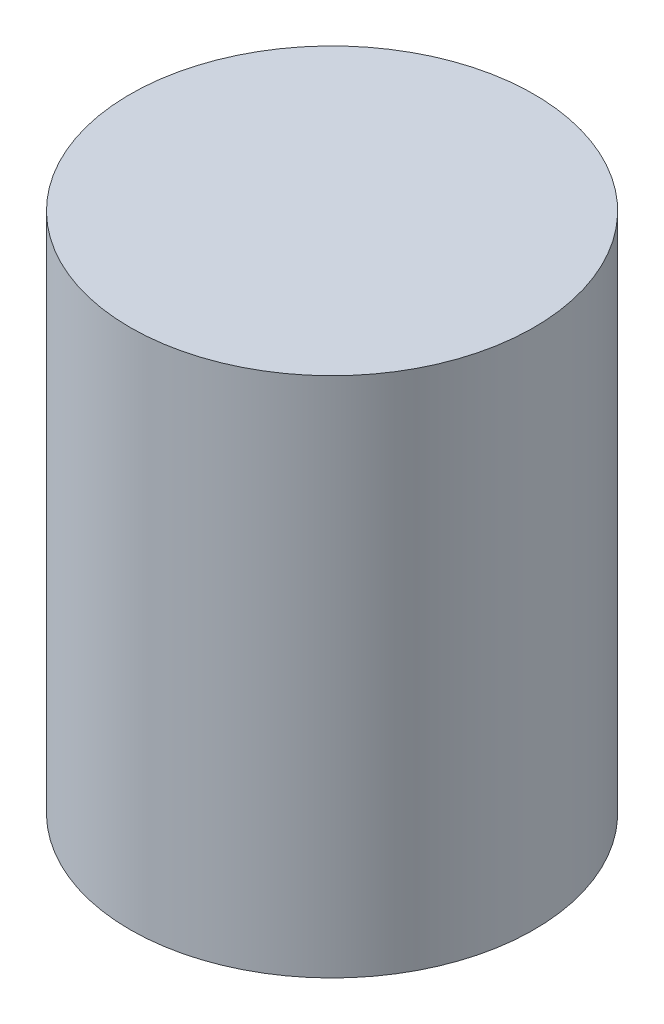
ISO-10303-21;
HEADER;
FILE_DESCRIPTION(('STEP AP214'),'2;1');
FILE_NAME('part.step','',(''),(''),'','','');
FILE_SCHEMA(('AUTOMOTIVE_DESIGN { 1 0 10303 214 1 1 1 1 }'));
ENDSEC;
DATA;
#1=APPLICATION_CONTEXT('core data for automotive mechanical design processes');
#2=APPLICATION_PROTOCOL_DEFINITION('international standard','automotive_design',2000,#1);
#3=PRODUCT_CONTEXT('',#1,'mechanical');
#4=PRODUCT('Part','Part','',(#3));
#5=PRODUCT_RELATED_PRODUCT_CATEGORY('part','',(#4));
#6=PRODUCT_DEFINITION_FORMATION('','',#4);
#7=PRODUCT_DEFINITION_CONTEXT('part definition',#1,'design');
#8=PRODUCT_DEFINITION('design','',#6,#7);
#9=PRODUCT_DEFINITION_SHAPE('','',#8);
#10=(LENGTH_UNIT() NAMED_UNIT(*) SI_UNIT(.MILLI.,.METRE.));
#11=(NAMED_UNIT(*) PLANE_ANGLE_UNIT() SI_UNIT($,.RADIAN.));
#12=(NAMED_UNIT(*) SI_UNIT($,.STERADIAN.) SOLID_ANGLE_UNIT());
#13=UNCERTAINTY_MEASURE_WITH_UNIT(LENGTH_MEASURE(1.E-05),#10,'distance_accuracy_value','');
#14=(GEOMETRIC_REPRESENTATION_CONTEXT(3) GLOBAL_UNCERTAINTY_ASSIGNED_CONTEXT((#13)) GLOBAL_UNIT_ASSIGNED_CONTEXT((#10,
#11,#12)) REPRESENTATION_CONTEXT('',''));
#15=CARTESIAN_POINT('',(0.,0.,0.));
#16=DIRECTION('',(0.,0.,1.));
#17=DIRECTION('',(1.,0.,0.));
#18=AXIS2_PLACEMENT_3D('',#15,#16,#17);
#19=CARTESIAN_POINT('',(0.,9.,0.));
#20=DIRECTION('',(0.,-1.,0.));
#21=DIRECTION('',(0.,0.,-1.));
#22=AXIS2_PLACEMENT_3D('',#19,#20,#21);
#23=CYLINDRICAL_SURFACE('',#22,3.485);
#24=CARTESIAN_POINT('',(0.,9.,0.));
#25=DIRECTION('',(0.,1.,0.));
#26=DIRECTION('',(0.,0.,1.));
#27=AXIS2_PLACEMENT_3D('',#24,#25,#26);
#28=CIRCLE('',#27,3.485);
#29=CARTESIAN_POINT('',(0.,9.,3.485));
#30=VERTEX_POINT('',#29);
#31=EDGE_CURVE('E10',#30,#30,#28,.T.);
#32=ORIENTED_EDGE('',*,*,#31,.F.);
#33=EDGE_LOOP('',(#32));
#34=FACE_BOUND('',#33,.T.);
#35=CARTESIAN_POINT('',(0.,0.,0.));
#36=DIRECTION('',(0.,1.,0.));
#37=DIRECTION('',(0.,0.,1.));
#38=AXIS2_PLACEMENT_3D('',#35,#36,#37);
#39=CIRCLE('',#38,3.485);
#40=CARTESIAN_POINT('',(0.,0.,3.485));
#41=VERTEX_POINT('',#40);
#42=EDGE_CURVE('E44',#41,#41,#39,.T.);
#43=ORIENTED_EDGE('',*,*,#42,.T.);
#44=EDGE_LOOP('',(#43));
#45=FACE_BOUND('',#44,.T.);
#46=ADVANCED_FACE('F41',(#34,#45),#23,.T.);
#47=CARTESIAN_POINT('',(0.,9.,0.));
#48=DIRECTION('',(0.,1.,0.));
#49=DIRECTION('',(0.,0.,1.));
#50=AXIS2_PLACEMENT_3D('',#47,#48,#49);
#51=PLANE('',#50);
#52=ORIENTED_EDGE('',*,*,#31,.T.);
#53=EDGE_LOOP('',(#52));
#54=FACE_BOUND('',#53,.T.);
#55=ADVANCED_FACE('F56',(#54),#51,.T.);
#56=CARTESIAN_POINT('',(0.,0.,0.));
#57=DIRECTION('',(0.,1.,0.));
#58=DIRECTION('',(0.,0.,1.));
#59=AXIS2_PLACEMENT_3D('',#56,#57,#58);
#60=PLANE('',#59);
#61=ORIENTED_EDGE('',*,*,#42,.F.);
#62=EDGE_LOOP('',(#61));
#63=FACE_BOUND('',#62,.T.);
#64=ADVANCED_FACE('F54',(#63),#60,.F.);
#65=CLOSED_SHELL('',(#46,#55,#64));
#66=MANIFOLD_SOLID_BREP('B2',#65);
#67=ADVANCED_BREP_SHAPE_REPRESENTATION('',(#18,#66),#14);
#68=SHAPE_DEFINITION_REPRESENTATION(#9,#67);
ENDSEC;
END-ISO-10303-21;
